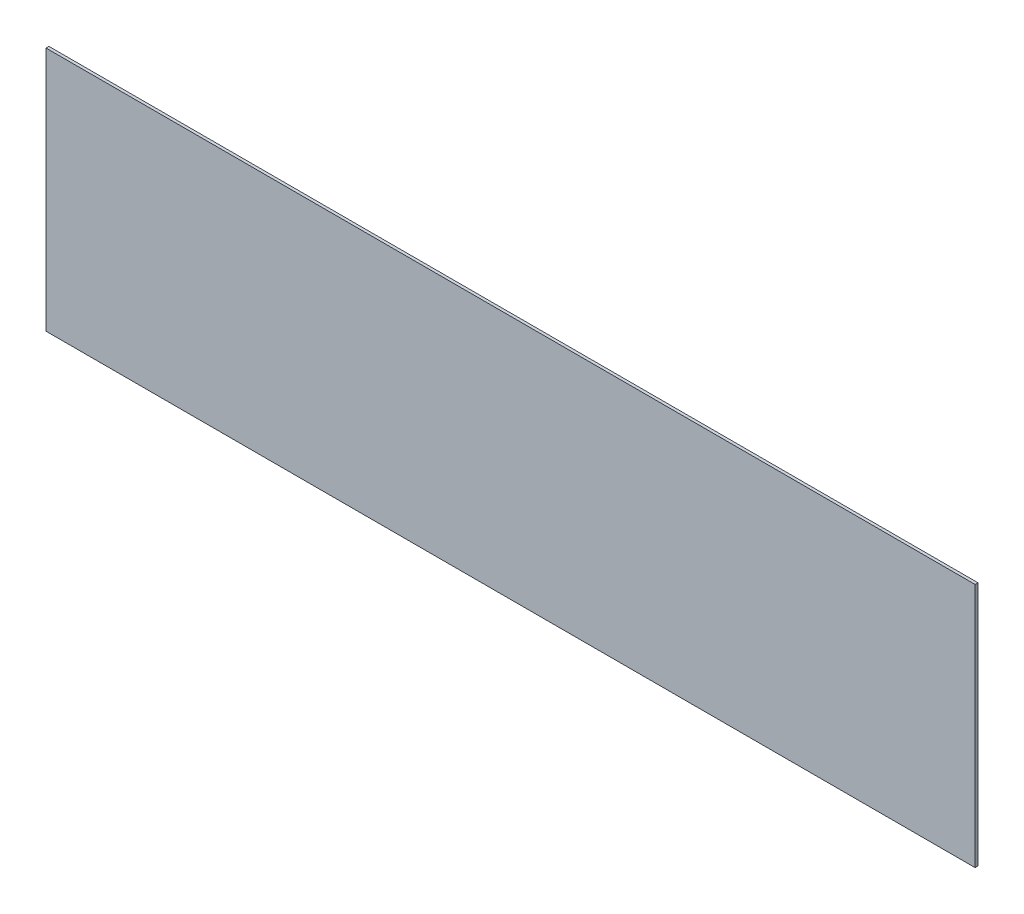
ISO-10303-21;
HEADER;
FILE_DESCRIPTION(('STEP AP214'),'2;1');
FILE_NAME('part.step','',(''),(''),'','','');
FILE_SCHEMA(('AUTOMOTIVE_DESIGN { 1 0 10303 214 1 1 1 1 }'));
ENDSEC;
DATA;
#1=APPLICATION_CONTEXT('core data for automotive mechanical design processes');
#2=APPLICATION_PROTOCOL_DEFINITION('international standard','automotive_design',2000,#1);
#3=PRODUCT_CONTEXT('',#1,'mechanical');
#4=PRODUCT('Part','Part','',(#3));
#5=PRODUCT_RELATED_PRODUCT_CATEGORY('part','',(#4));
#6=PRODUCT_DEFINITION_FORMATION('','',#4);
#7=PRODUCT_DEFINITION_CONTEXT('part definition',#1,'design');
#8=PRODUCT_DEFINITION('design','',#6,#7);
#9=PRODUCT_DEFINITION_SHAPE('','',#8);
#10=(LENGTH_UNIT() NAMED_UNIT(*) SI_UNIT(.MILLI.,.METRE.));
#11=(NAMED_UNIT(*) PLANE_ANGLE_UNIT() SI_UNIT($,.RADIAN.));
#12=(NAMED_UNIT(*) SI_UNIT($,.STERADIAN.) SOLID_ANGLE_UNIT());
#13=UNCERTAINTY_MEASURE_WITH_UNIT(LENGTH_MEASURE(1.E-05),#10,'distance_accuracy_value','');
#14=(GEOMETRIC_REPRESENTATION_CONTEXT(3) GLOBAL_UNCERTAINTY_ASSIGNED_CONTEXT((#13)) GLOBAL_UNIT_ASSIGNED_CONTEXT((#10,
#11,#12)) REPRESENTATION_CONTEXT('',''));
#15=CARTESIAN_POINT('',(0.,0.,0.));
#16=DIRECTION('',(0.,0.,1.));
#17=DIRECTION('',(1.,0.,0.));
#18=AXIS2_PLACEMENT_3D('',#15,#16,#17);
#19=CARTESIAN_POINT('',(0.,0.,0.));
#20=DIRECTION('',(0.,0.,1.));
#21=DIRECTION('',(1.,0.,0.));
#22=AXIS2_PLACEMENT_3D('',#19,#20,#21);
#23=PLANE('',#22);
#24=DIRECTION('',(1.,0.,0.));
#25=VECTOR('',#24,1.);
#26=CARTESIAN_POINT('',(16.1,4.25,0.));
#27=LINE('',#26,#25);
#28=CARTESIAN_POINT('',(16.1,4.25,0.));
#29=VERTEX_POINT('',#28);
#30=CARTESIAN_POINT('',(-16.1,4.25,0.));
#31=VERTEX_POINT('',#30);
#32=EDGE_CURVE('E79',#29,#31,#27,.F.);
#33=ORIENTED_EDGE('',*,*,#32,.F.);
#34=DIRECTION('',(0.,1.,0.));
#35=VECTOR('',#34,1.);
#36=CARTESIAN_POINT('',(16.1,-4.25,0.));
#37=LINE('',#36,#35);
#38=CARTESIAN_POINT('',(16.1,-4.25,0.));
#39=VERTEX_POINT('',#38);
#40=EDGE_CURVE('E55',#39,#29,#37,.T.);
#41=ORIENTED_EDGE('',*,*,#40,.F.);
#42=DIRECTION('',(1.,0.,0.));
#43=VECTOR('',#42,1.);
#44=CARTESIAN_POINT('',(-16.1,-4.25,0.));
#45=LINE('',#44,#43);
#46=CARTESIAN_POINT('',(-16.1,-4.25,0.));
#47=VERTEX_POINT('',#46);
#48=EDGE_CURVE('E57',#47,#39,#45,.T.);
#49=ORIENTED_EDGE('',*,*,#48,.F.);
#50=DIRECTION('',(0.,1.,0.));
#51=VECTOR('',#50,1.);
#52=CARTESIAN_POINT('',(-16.1,4.25,0.));
#53=LINE('',#52,#51);
#54=EDGE_CURVE('E20',#31,#47,#53,.F.);
#55=ORIENTED_EDGE('',*,*,#54,.F.);
#56=EDGE_LOOP('',(#33,#41,#49,#55));
#57=FACE_BOUND('',#56,.T.);
#58=ADVANCED_FACE('F17',(#57),#23,.F.);
#59=CARTESIAN_POINT('',(-16.1,4.25,0.));
#60=DIRECTION('',(-1.,0.,0.));
#61=DIRECTION('',(0.,0.,1.));
#62=AXIS2_PLACEMENT_3D('',#59,#60,#61);
#63=PLANE('',#62);
#64=DIRECTION('',(0.,1.,0.));
#65=VECTOR('',#64,1.);
#66=CARTESIAN_POINT('',(-16.1,0.,0.1));
#67=LINE('',#66,#65);
#68=CARTESIAN_POINT('',(-16.1,4.25,0.1));
#69=VERTEX_POINT('',#68);
#70=CARTESIAN_POINT('',(-16.1,-4.25,0.1));
#71=VERTEX_POINT('',#70);
#72=EDGE_CURVE('E83',#69,#71,#67,.F.);
#73=ORIENTED_EDGE('',*,*,#72,.F.);
#74=DIRECTION('',(0.,0.,1.));
#75=VECTOR('',#74,1.);
#76=CARTESIAN_POINT('',(-16.1,4.25,0.));
#77=LINE('',#76,#75);
#78=EDGE_CURVE('E68',#31,#69,#77,.T.);
#79=ORIENTED_EDGE('',*,*,#78,.F.);
#80=ORIENTED_EDGE('',*,*,#54,.T.);
#81=DIRECTION('',(0.,0.,-1.));
#82=VECTOR('',#81,1.);
#83=CARTESIAN_POINT('',(-16.1,-4.25,0.));
#84=LINE('',#83,#82);
#85=EDGE_CURVE('E63',#71,#47,#84,.T.);
#86=ORIENTED_EDGE('',*,*,#85,.F.);
#87=EDGE_LOOP('',(#73,#79,#80,#86));
#88=FACE_BOUND('',#87,.T.);
#89=ADVANCED_FACE('F65',(#88),#63,.T.);
#90=CARTESIAN_POINT('',(-16.1,-4.25,0.));
#91=DIRECTION('',(0.,-1.,0.));
#92=DIRECTION('',(0.,0.,-1.));
#93=AXIS2_PLACEMENT_3D('',#90,#91,#92);
#94=PLANE('',#93);
#95=DIRECTION('',(1.,0.,0.));
#96=VECTOR('',#95,1.);
#97=CARTESIAN_POINT('',(0.,-4.25,0.1));
#98=LINE('',#97,#96);
#99=CARTESIAN_POINT('',(16.1,-4.25,0.1));
#100=VERTEX_POINT('',#99);
#101=EDGE_CURVE('E72',#71,#100,#98,.T.);
#102=ORIENTED_EDGE('',*,*,#101,.F.);
#103=ORIENTED_EDGE('',*,*,#85,.T.);
#104=ORIENTED_EDGE('',*,*,#48,.T.);
#105=DIRECTION('',(0.,0.,-1.));
#106=VECTOR('',#105,1.);
#107=CARTESIAN_POINT('',(16.1,-4.25,0.));
#108=LINE('',#107,#106);
#109=EDGE_CURVE('E75',#100,#39,#108,.T.);
#110=ORIENTED_EDGE('',*,*,#109,.F.);
#111=EDGE_LOOP('',(#102,#103,#104,#110));
#112=FACE_BOUND('',#111,.T.);
#113=ADVANCED_FACE('F70',(#112),#94,.T.);
#114=CARTESIAN_POINT('',(16.1,-4.25,0.));
#115=DIRECTION('',(1.,0.,0.));
#116=DIRECTION('',(0.,0.,-1.));
#117=AXIS2_PLACEMENT_3D('',#114,#115,#116);
#118=PLANE('',#117);
#119=DIRECTION('',(0.,1.,0.));
#120=VECTOR('',#119,1.);
#121=CARTESIAN_POINT('',(16.1,0.,0.1));
#122=LINE('',#121,#120);
#123=CARTESIAN_POINT('',(16.1,4.25,0.1));
#124=VERTEX_POINT('',#123);
#125=EDGE_CURVE('E26',#100,#124,#122,.T.);
#126=ORIENTED_EDGE('',*,*,#125,.F.);
#127=ORIENTED_EDGE('',*,*,#109,.T.);
#128=ORIENTED_EDGE('',*,*,#40,.T.);
#129=DIRECTION('',(0.,0.,1.));
#130=VECTOR('',#129,1.);
#131=CARTESIAN_POINT('',(16.1,4.25,0.));
#132=LINE('',#131,#130);
#133=EDGE_CURVE('E35',#124,#29,#132,.F.);
#134=ORIENTED_EDGE('',*,*,#133,.F.);
#135=EDGE_LOOP('',(#126,#127,#128,#134));
#136=FACE_BOUND('',#135,.T.);
#137=ADVANCED_FACE('F89',(#136),#118,.T.);
#138=CARTESIAN_POINT('',(16.1,4.25,0.));
#139=DIRECTION('',(0.,1.,0.));
#140=DIRECTION('',(0.,0.,1.));
#141=AXIS2_PLACEMENT_3D('',#138,#139,#140);
#142=PLANE('',#141);
#143=DIRECTION('',(1.,0.,0.));
#144=VECTOR('',#143,1.);
#145=CARTESIAN_POINT('',(0.,4.25,0.1));
#146=LINE('',#145,#144);
#147=EDGE_CURVE('E11',#124,#69,#146,.F.);
#148=ORIENTED_EDGE('',*,*,#147,.F.);
#149=ORIENTED_EDGE('',*,*,#133,.T.);
#150=ORIENTED_EDGE('',*,*,#32,.T.);
#151=ORIENTED_EDGE('',*,*,#78,.T.);
#152=EDGE_LOOP('',(#148,#149,#150,#151));
#153=FACE_BOUND('',#152,.T.);
#154=ADVANCED_FACE('F91',(#153),#142,.T.);
#155=CARTESIAN_POINT('',(0.,0.,0.1));
#156=DIRECTION('',(0.,0.,1.));
#157=DIRECTION('',(1.,0.,0.));
#158=AXIS2_PLACEMENT_3D('',#155,#156,#157);
#159=PLANE('',#158);
#160=ORIENTED_EDGE('',*,*,#125,.T.);
#161=ORIENTED_EDGE('',*,*,#147,.T.);
#162=ORIENTED_EDGE('',*,*,#72,.T.);
#163=ORIENTED_EDGE('',*,*,#101,.T.);
#164=EDGE_LOOP('',(#160,#161,#162,#163));
#165=FACE_BOUND('',#164,.T.);
#166=ADVANCED_FACE('F88',(#165),#159,.T.);
#167=CLOSED_SHELL('',(#58,#89,#113,#137,#154,#166));
#168=MANIFOLD_SOLID_BREP('B1',#167);
#169=ADVANCED_BREP_SHAPE_REPRESENTATION('',(#18,#168),#14);
#170=SHAPE_DEFINITION_REPRESENTATION(#9,#169);
ENDSEC;
END-ISO-10303-21;
